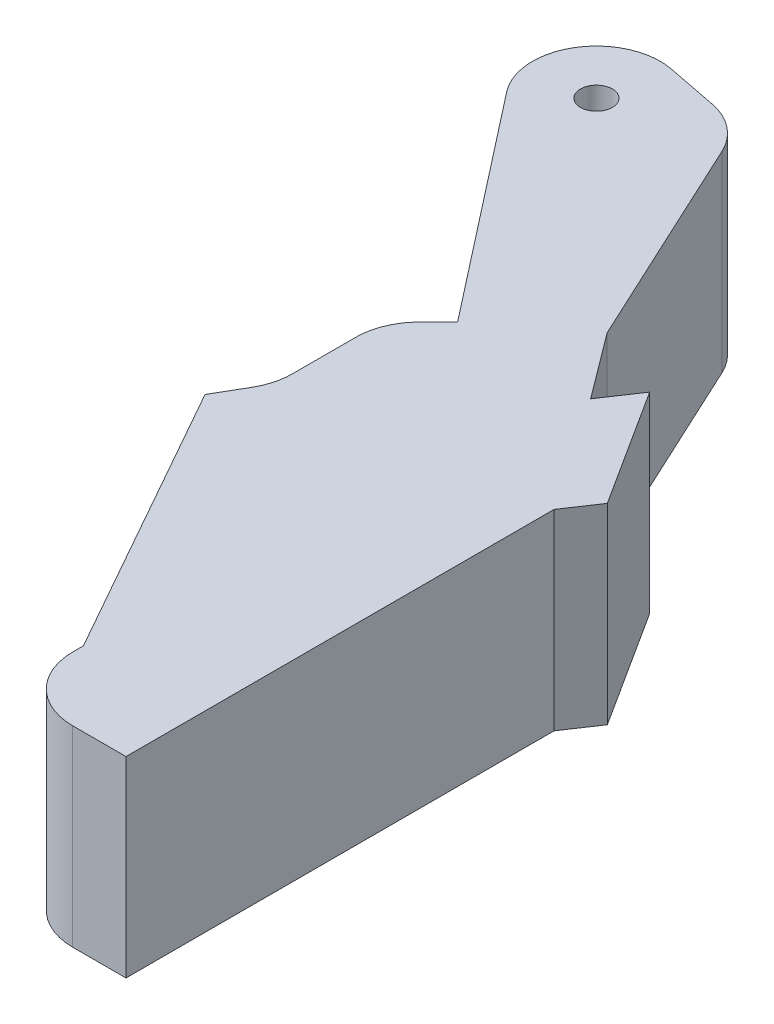
ISO-10303-21;
HEADER;
FILE_DESCRIPTION(('STEP AP214'),'2;1');
FILE_NAME('part.step','',(''),(''),'','','');
FILE_SCHEMA(('AUTOMOTIVE_DESIGN { 1 0 10303 214 1 1 1 1 }'));
ENDSEC;
DATA;
#1=APPLICATION_CONTEXT('core data for automotive mechanical design processes');
#2=APPLICATION_PROTOCOL_DEFINITION('international standard','automotive_design',2000,#1);
#3=PRODUCT_CONTEXT('',#1,'mechanical');
#4=PRODUCT('Part','Part','',(#3));
#5=PRODUCT_RELATED_PRODUCT_CATEGORY('part','',(#4));
#6=PRODUCT_DEFINITION_FORMATION('','',#4);
#7=PRODUCT_DEFINITION_CONTEXT('part definition',#1,'design');
#8=PRODUCT_DEFINITION('design','',#6,#7);
#9=PRODUCT_DEFINITION_SHAPE('','',#8);
#10=(LENGTH_UNIT() NAMED_UNIT(*) SI_UNIT(.MILLI.,.METRE.));
#11=(NAMED_UNIT(*) PLANE_ANGLE_UNIT() SI_UNIT($,.RADIAN.));
#12=(NAMED_UNIT(*) SI_UNIT($,.STERADIAN.) SOLID_ANGLE_UNIT());
#13=UNCERTAINTY_MEASURE_WITH_UNIT(LENGTH_MEASURE(1.E-05),#10,'distance_accuracy_value','');
#14=(GEOMETRIC_REPRESENTATION_CONTEXT(3) GLOBAL_UNCERTAINTY_ASSIGNED_CONTEXT((#13)) GLOBAL_UNIT_ASSIGNED_CONTEXT((#10,
#11,#12)) REPRESENTATION_CONTEXT('',''));
#15=CARTESIAN_POINT('',(0.,0.,0.));
#16=DIRECTION('',(0.,0.,1.));
#17=DIRECTION('',(1.,0.,0.));
#18=AXIS2_PLACEMENT_3D('',#15,#16,#17);
#19=CARTESIAN_POINT('',(26.2980985027857,9.,33.6825538196853));
#20=DIRECTION('',(0.713266412495161,0.,0.700893019516019));
#21=DIRECTION('',(0.700893019516019,0.,-0.713266412495161));
#22=AXIS2_PLACEMENT_3D('',#19,#20,#21);
#23=PLANE('',#22);
#24=DIRECTION('',(-0.700893019516019,0.,0.713266412495161));
#25=VECTOR('',#24,1.);
#26=CARTESIAN_POINT('',(26.2980985027857,-9.,33.6825538196853));
#27=LINE('',#26,#25);
#28=CARTESIAN_POINT('',(26.2980985027857,-9.,33.6825538196853));
#29=VERTEX_POINT('',#28);
#30=CARTESIAN_POINT('',(24.4923759572537,-9.,35.5201541469117));
#31=VERTEX_POINT('',#30);
#32=EDGE_CURVE('E216',#29,#31,#27,.T.);
#33=ORIENTED_EDGE('',*,*,#32,.T.);
#34=DIRECTION('',(0.,-1.,0.));
#35=VECTOR('',#34,1.);
#36=CARTESIAN_POINT('',(24.4923759572537,9.,35.5201541469117));
#37=LINE('',#36,#35);
#38=CARTESIAN_POINT('',(24.4923759572537,9.,35.5201541469117));
#39=VERTEX_POINT('',#38);
#40=EDGE_CURVE('E294',#31,#39,#37,.F.);
#41=ORIENTED_EDGE('',*,*,#40,.T.);
#42=DIRECTION('',(-0.700893019516019,0.,0.713266412495161));
#43=VECTOR('',#42,1.);
#44=CARTESIAN_POINT('',(26.2980985027857,9.,33.6825538196853));
#45=LINE('',#44,#43);
#46=CARTESIAN_POINT('',(26.2980985027857,9.,33.6825538196853));
#47=VERTEX_POINT('',#46);
#48=EDGE_CURVE('E251',#47,#39,#45,.T.);
#49=ORIENTED_EDGE('',*,*,#48,.F.);
#50=DIRECTION('',(0.,-1.,0.));
#51=VECTOR('',#50,1.);
#52=CARTESIAN_POINT('',(26.2980985027857,9.,33.6825538196853));
#53=LINE('',#52,#51);
#54=EDGE_CURVE('E215',#47,#29,#53,.T.);
#55=ORIENTED_EDGE('',*,*,#54,.T.);
#56=EDGE_LOOP('',(#33,#41,#49,#55));
#57=FACE_BOUND('',#56,.T.);
#58=ADVANCED_FACE('F32',(#57),#23,.F.);
#59=CARTESIAN_POINT('',(22.7719744322246,9.,37.270927217324));
#60=DIRECTION('',(1.,0.,0.));
#61=DIRECTION('',(0.,0.,-1.));
#62=AXIS2_PLACEMENT_3D('',#59,#60,#61);
#63=PLANE('',#62);
#64=DIRECTION('',(0.,0.,1.));
#65=VECTOR('',#64,1.);
#66=CARTESIAN_POINT('',(22.7719744322246,9.,37.270927217324));
#67=LINE('',#66,#65);
#68=CARTESIAN_POINT('',(22.7719744322246,9.,39.7255122640078));
#69=VERTEX_POINT('',#68);
#70=CARTESIAN_POINT('',(22.7719744322246,9.,45.6584863931885));
#71=VERTEX_POINT('',#70);
#72=EDGE_CURVE('E174',#69,#71,#67,.T.);
#73=ORIENTED_EDGE('',*,*,#72,.F.);
#74=DIRECTION('',(0.,-1.,0.));
#75=VECTOR('',#74,1.);
#76=CARTESIAN_POINT('',(22.7719744322246,9.,39.7255122640078));
#77=LINE('',#76,#75);
#78=CARTESIAN_POINT('',(22.7719744322246,-9.,39.7255122640078));
#79=VERTEX_POINT('',#78);
#80=EDGE_CURVE('E289',#69,#79,#77,.T.);
#81=ORIENTED_EDGE('',*,*,#80,.T.);
#82=DIRECTION('',(0.,0.,1.));
#83=VECTOR('',#82,1.);
#84=CARTESIAN_POINT('',(22.7719744322246,-9.,37.270927217324));
#85=LINE('',#84,#83);
#86=CARTESIAN_POINT('',(22.7719744322246,-9.,45.6584863931885));
#87=VERTEX_POINT('',#86);
#88=EDGE_CURVE('E219',#79,#87,#85,.T.);
#89=ORIENTED_EDGE('',*,*,#88,.T.);
#90=DIRECTION('',(0.,-1.,0.));
#91=VECTOR('',#90,1.);
#92=CARTESIAN_POINT('',(22.7719744322246,9.,45.6584863931885));
#93=LINE('',#92,#91);
#94=EDGE_CURVE('E287',#87,#71,#93,.F.);
#95=ORIENTED_EDGE('',*,*,#94,.T.);
#96=EDGE_LOOP('',(#73,#81,#89,#95));
#97=FACE_BOUND('',#96,.T.);
#98=ADVANCED_FACE('F340',(#97),#63,.F.);
#99=CARTESIAN_POINT('',(22.7719744322246,9.,47.270927217324));
#100=DIRECTION('',(0.865286645538015,0.,0.501277389330069));
#101=DIRECTION('',(0.501277389330069,0.,-0.865286645538015));
#102=AXIS2_PLACEMENT_3D('',#99,#100,#101);
#103=PLANE('',#102);
#104=DIRECTION('',(-0.501277389330069,0.,0.865286645538015));
#105=VECTOR('',#104,1.);
#106=CARTESIAN_POINT('',(22.7719744322246,9.,47.270927217324));
#107=LINE('',#106,#105);
#108=CARTESIAN_POINT('',(21.9636943054527,9.,48.6661507291689));
#109=VERTEX_POINT('',#108);
#110=CARTESIAN_POINT('',(20.3513196414554,9.,51.4493727416863));
#111=VERTEX_POINT('',#110);
#112=EDGE_CURVE('E162',#109,#111,#107,.T.);
#113=ORIENTED_EDGE('',*,*,#112,.F.);
#114=DIRECTION('',(0.,-1.,0.));
#115=VECTOR('',#114,1.);
#116=CARTESIAN_POINT('',(21.9636943054527,-9.,48.6661507291689));
#117=LINE('',#116,#115);
#118=CARTESIAN_POINT('',(21.9636943054527,-9.,48.6661507291689));
#119=VERTEX_POINT('',#118);
#120=EDGE_CURVE('E298',#109,#119,#117,.T.);
#121=ORIENTED_EDGE('',*,*,#120,.T.);
#122=DIRECTION('',(-0.501277389330069,0.,0.865286645538015));
#123=VECTOR('',#122,1.);
#124=CARTESIAN_POINT('',(22.7719744322246,-9.,47.270927217324));
#125=LINE('',#124,#123);
#126=CARTESIAN_POINT('',(20.3513196414554,-9.,51.4493727416863));
#127=VERTEX_POINT('',#126);
#128=EDGE_CURVE('E180',#119,#127,#125,.T.);
#129=ORIENTED_EDGE('',*,*,#128,.T.);
#130=DIRECTION('',(0.,-1.,0.));
#131=VECTOR('',#130,1.);
#132=CARTESIAN_POINT('',(20.3513196414554,9.,51.4493727416863));
#133=LINE('',#132,#131);
#134=EDGE_CURVE('E177',#111,#127,#133,.T.);
#135=ORIENTED_EDGE('',*,*,#134,.F.);
#136=EDGE_LOOP('',(#113,#121,#129,#135));
#137=FACE_BOUND('',#136,.T.);
#138=ADVANCED_FACE('F178',(#137),#103,.F.);
#139=CARTESIAN_POINT('',(20.3513196414554,9.,51.4493727416863));
#140=DIRECTION('',(0.871303410753923,0.,-0.490744705940453));
#141=DIRECTION('',(-0.490744705940453,0.,-0.871303410753923));
#142=AXIS2_PLACEMENT_3D('',#139,#140,#141);
#143=PLANE('',#142);
#144=DIRECTION('',(0.490744705940453,0.,0.871303410753923));
#145=VECTOR('',#144,1.);
#146=CARTESIAN_POINT('',(20.3513196414554,-9.,51.4493727416863));
#147=LINE('',#146,#145);
#148=CARTESIAN_POINT('',(35.073660819669,-9.,77.5884750643039));
#149=VERTEX_POINT('',#148);
#150=EDGE_CURVE('E224',#127,#149,#147,.T.);
#151=ORIENTED_EDGE('',*,*,#150,.T.);
#152=DIRECTION('',(0.,-1.,0.));
#153=VECTOR('',#152,1.);
#154=CARTESIAN_POINT('',(35.073660819669,9.,77.5884750643039));
#155=LINE('',#154,#153);
#156=CARTESIAN_POINT('',(35.073660819669,9.,77.5884750643039));
#157=VERTEX_POINT('',#156);
#158=EDGE_CURVE('E184',#157,#149,#155,.T.);
#159=ORIENTED_EDGE('',*,*,#158,.F.);
#160=DIRECTION('',(0.490744705940453,0.,0.871303410753923));
#161=VECTOR('',#160,1.);
#162=CARTESIAN_POINT('',(20.3513196414554,9.,51.4493727416863));
#163=LINE('',#162,#161);
#164=EDGE_CURVE('E166',#111,#157,#163,.T.);
#165=ORIENTED_EDGE('',*,*,#164,.F.);
#166=ORIENTED_EDGE('',*,*,#134,.T.);
#167=EDGE_LOOP('',(#151,#159,#165,#166));
#168=FACE_BOUND('',#167,.T.);
#169=ADVANCED_FACE('F186',(#168),#143,.F.);
#170=CARTESIAN_POINT('',(35.073660819669,9.,77.5884750643039));
#171=DIRECTION('',(1.,0.,0.));
#172=DIRECTION('',(0.,0.,-1.));
#173=AXIS2_PLACEMENT_3D('',#170,#171,#172);
#174=PLANE('',#173);
#175=DIRECTION('',(0.,0.,1.));
#176=VECTOR('',#175,1.);
#177=CARTESIAN_POINT('',(35.073660819669,-9.,77.5884750643039));
#178=LINE('',#177,#176);
#179=CARTESIAN_POINT('',(35.073660819669,-9.,78.5884750643039));
#180=VERTEX_POINT('',#179);
#181=EDGE_CURVE('E226',#149,#180,#178,.T.);
#182=ORIENTED_EDGE('',*,*,#181,.T.);
#183=DIRECTION('',(0.,-1.,0.));
#184=VECTOR('',#183,1.);
#185=CARTESIAN_POINT('',(35.073660819669,9.,78.5884750643039));
#186=LINE('',#185,#184);
#187=CARTESIAN_POINT('',(35.073660819669,9.,78.5884750643039));
#188=VERTEX_POINT('',#187);
#189=EDGE_CURVE('E40',#180,#188,#186,.F.);
#190=ORIENTED_EDGE('',*,*,#189,.T.);
#191=DIRECTION('',(0.,0.,1.));
#192=VECTOR('',#191,1.);
#193=CARTESIAN_POINT('',(35.073660819669,9.,77.5884750643039));
#194=LINE('',#193,#192);
#195=EDGE_CURVE('E188',#157,#188,#194,.T.);
#196=ORIENTED_EDGE('',*,*,#195,.F.);
#197=ORIENTED_EDGE('',*,*,#158,.T.);
#198=EDGE_LOOP('',(#182,#190,#196,#197));
#199=FACE_BOUND('',#198,.T.);
#200=ADVANCED_FACE('F419',(#199),#174,.F.);
#201=CARTESIAN_POINT('',(35.073660819669,9.,84.5884750643039));
#202=DIRECTION('',(0.,0.,-1.));
#203=DIRECTION('',(-1.,0.,0.));
#204=AXIS2_PLACEMENT_3D('',#201,#202,#203);
#205=PLANE('',#204);
#206=DIRECTION('',(1.,0.,0.));
#207=VECTOR('',#206,1.);
#208=CARTESIAN_POINT('',(35.073660819669,9.,84.5884750643039));
#209=LINE('',#208,#207);
#210=CARTESIAN_POINT('',(41.073660819669,9.,84.5884750643039));
#211=VERTEX_POINT('',#210);
#212=CARTESIAN_POINT('',(46.073660819669,9.,84.5884750643039));
#213=VERTEX_POINT('',#212);
#214=EDGE_CURVE('E190',#211,#213,#209,.T.);
#215=ORIENTED_EDGE('',*,*,#214,.F.);
#216=DIRECTION('',(0.,-1.,0.));
#217=VECTOR('',#216,1.);
#218=CARTESIAN_POINT('',(41.073660819669,9.,84.5884750643039));
#219=LINE('',#218,#217);
#220=CARTESIAN_POINT('',(41.073660819669,-9.,84.5884750643039));
#221=VERTEX_POINT('',#220);
#222=EDGE_CURVE('E303',#211,#221,#219,.T.);
#223=ORIENTED_EDGE('',*,*,#222,.T.);
#224=DIRECTION('',(1.,0.,0.));
#225=VECTOR('',#224,1.);
#226=CARTESIAN_POINT('',(35.073660819669,-9.,84.5884750643039));
#227=LINE('',#226,#225);
#228=CARTESIAN_POINT('',(46.073660819669,-9.,84.5884750643039));
#229=VERTEX_POINT('',#228);
#230=EDGE_CURVE('E228',#221,#229,#227,.T.);
#231=ORIENTED_EDGE('',*,*,#230,.T.);
#232=DIRECTION('',(0.,-1.,0.));
#233=VECTOR('',#232,1.);
#234=CARTESIAN_POINT('',(46.073660819669,9.,84.5884750643039));
#235=LINE('',#234,#233);
#236=EDGE_CURVE('E266',#213,#229,#235,.T.);
#237=ORIENTED_EDGE('',*,*,#236,.F.);
#238=EDGE_LOOP('',(#215,#223,#231,#237));
#239=FACE_BOUND('',#238,.T.);
#240=ADVANCED_FACE('F309',(#239),#205,.F.);
#241=CARTESIAN_POINT('',(46.073660819669,9.,84.5884750643039));
#242=DIRECTION('',(-1.,0.,0.));
#243=DIRECTION('',(0.,0.,1.));
#244=AXIS2_PLACEMENT_3D('',#241,#242,#243);
#245=PLANE('',#244);
#246=DIRECTION('',(0.,0.,-1.));
#247=VECTOR('',#246,1.);
#248=CARTESIAN_POINT('',(46.073660819669,-9.,84.5884750643039));
#249=LINE('',#248,#247);
#250=CARTESIAN_POINT('',(46.073660819669,-9.,44.4086004960532));
#251=VERTEX_POINT('',#250);
#252=EDGE_CURVE('E230',#229,#251,#249,.T.);
#253=ORIENTED_EDGE('',*,*,#252,.T.);
#254=DIRECTION('',(0.,-1.,0.));
#255=VECTOR('',#254,1.);
#256=CARTESIAN_POINT('',(46.073660819669,9.,44.4086004960532));
#257=LINE('',#256,#255);
#258=CARTESIAN_POINT('',(46.073660819669,9.,44.4086004960532));
#259=VERTEX_POINT('',#258);
#260=EDGE_CURVE('E263',#259,#251,#257,.T.);
#261=ORIENTED_EDGE('',*,*,#260,.F.);
#262=DIRECTION('',(0.,0.,-1.));
#263=VECTOR('',#262,1.);
#264=CARTESIAN_POINT('',(46.073660819669,9.,84.5884750643039));
#265=LINE('',#264,#263);
#266=EDGE_CURVE('E195',#213,#259,#265,.T.);
#267=ORIENTED_EDGE('',*,*,#266,.F.);
#268=ORIENTED_EDGE('',*,*,#236,.T.);
#269=EDGE_LOOP('',(#253,#261,#267,#268));
#270=FACE_BOUND('',#269,.T.);
#271=ADVANCED_FACE('F319',(#270),#245,.F.);
#272=CARTESIAN_POINT('',(46.073660819669,9.,44.4086004960532));
#273=DIRECTION('',(-0.830910584121357,0.,-0.556405967972222));
#274=DIRECTION('',(-0.556405967972222,0.,0.830910584121357));
#275=AXIS2_PLACEMENT_3D('',#272,#273,#274);
#276=PLANE('',#275);
#277=DIRECTION('',(0.556405967972222,0.,-0.830910584121357));
#278=VECTOR('',#277,1.);
#279=CARTESIAN_POINT('',(46.073660819669,-9.,44.4086004960532));
#280=LINE('',#279,#278);
#281=CARTESIAN_POINT('',(48.0785400909475,-9.,41.4146077959714));
#282=VERTEX_POINT('',#281);
#283=EDGE_CURVE('E232',#251,#282,#280,.T.);
#284=ORIENTED_EDGE('',*,*,#283,.T.);
#285=DIRECTION('',(0.,-1.,0.));
#286=VECTOR('',#285,1.);
#287=CARTESIAN_POINT('',(48.0785400909475,9.,41.4146077959714));
#288=LINE('',#287,#286);
#289=CARTESIAN_POINT('',(48.0785400909475,9.,41.4146077959714));
#290=VERTEX_POINT('',#289);
#291=EDGE_CURVE('E260',#290,#282,#288,.T.);
#292=ORIENTED_EDGE('',*,*,#291,.F.);
#293=DIRECTION('',(0.556405967972222,0.,-0.830910584121357));
#294=VECTOR('',#293,1.);
#295=CARTESIAN_POINT('',(46.073660819669,9.,44.4086004960532));
#296=LINE('',#295,#294);
#297=EDGE_CURVE('E197',#259,#290,#296,.T.);
#298=ORIENTED_EDGE('',*,*,#297,.F.);
#299=ORIENTED_EDGE('',*,*,#260,.T.);
#300=EDGE_LOOP('',(#284,#292,#298,#299));
#301=FACE_BOUND('',#300,.T.);
#302=ADVANCED_FACE('F323',(#301),#276,.F.);
#303=CARTESIAN_POINT('',(48.0785400909475,9.,41.4146077959714));
#304=DIRECTION('',(-0.842411688467819,0.,0.538834433878161));
#305=DIRECTION('',(0.538834433878161,0.,0.842411688467819));
#306=AXIS2_PLACEMENT_3D('',#303,#304,#305);
#307=PLANE('',#306);
#308=DIRECTION('',(-0.538834433878161,0.,-0.842411688467819));
#309=VECTOR('',#308,1.);
#310=CARTESIAN_POINT('',(48.0785400909475,-9.,41.4146077959714));
#311=LINE('',#310,#309);
#312=CARTESIAN_POINT('',(41.0230100067657,-9.,30.3840191075821));
#313=VERTEX_POINT('',#312);
#314=EDGE_CURVE('E234',#282,#313,#311,.T.);
#315=ORIENTED_EDGE('',*,*,#314,.T.);
#316=DIRECTION('',(0.,-1.,0.));
#317=VECTOR('',#316,1.);
#318=CARTESIAN_POINT('',(41.0230100067657,9.,30.3840191075821));
#319=LINE('',#318,#317);
#320=CARTESIAN_POINT('',(41.0230100067657,9.,30.3840191075821));
#321=VERTEX_POINT('',#320);
#322=EDGE_CURVE('E258',#321,#313,#319,.T.);
#323=ORIENTED_EDGE('',*,*,#322,.F.);
#324=DIRECTION('',(-0.538834433878161,0.,-0.842411688467819));
#325=VECTOR('',#324,1.);
#326=CARTESIAN_POINT('',(48.0785400909475,9.,41.4146077959714));
#327=LINE('',#326,#325);
#328=EDGE_CURVE('E199',#290,#321,#327,.T.);
#329=ORIENTED_EDGE('',*,*,#328,.F.);
#330=ORIENTED_EDGE('',*,*,#291,.T.);
#331=EDGE_LOOP('',(#315,#323,#329,#330));
#332=FACE_BOUND('',#331,.T.);
#333=ADVANCED_FACE('F408',(#332),#307,.F.);
#334=CARTESIAN_POINT('',(38.8008517192327,9.,33.7024861028828));
#335=DIRECTION('',(-0.830910584121357,0.,-0.556405967972222));
#336=DIRECTION('',(-0.556405967972222,0.,0.830910584121357));
#337=AXIS2_PLACEMENT_3D('',#334,#335,#336);
#338=PLANE('',#337);
#339=DIRECTION('',(0.556405967972222,0.,-0.830910584121357));
#340=VECTOR('',#339,1.);
#341=CARTESIAN_POINT('',(38.8008517192327,-9.,33.7024861028828));
#342=LINE('',#341,#340);
#343=CARTESIAN_POINT('',(38.8008517192327,-9.,33.7024861028828));
#344=VERTEX_POINT('',#343);
#345=EDGE_CURVE('E237',#344,#313,#342,.T.);
#346=ORIENTED_EDGE('',*,*,#345,.F.);
#347=DIRECTION('',(0.,-1.,0.));
#348=VECTOR('',#347,1.);
#349=CARTESIAN_POINT('',(38.8008517192327,9.,33.7024861028828));
#350=LINE('',#349,#348);
#351=CARTESIAN_POINT('',(38.8008517192327,9.,33.7024861028828));
#352=VERTEX_POINT('',#351);
#353=EDGE_CURVE('E256',#352,#344,#350,.T.);
#354=ORIENTED_EDGE('',*,*,#353,.F.);
#355=DIRECTION('',(0.556405967972222,0.,-0.830910584121357));
#356=VECTOR('',#355,1.);
#357=CARTESIAN_POINT('',(38.8008517192327,9.,33.7024861028828));
#358=LINE('',#357,#356);
#359=EDGE_CURVE('E201',#352,#321,#358,.T.);
#360=ORIENTED_EDGE('',*,*,#359,.T.);
#361=ORIENTED_EDGE('',*,*,#322,.T.);
#362=EDGE_LOOP('',(#346,#354,#360,#361));
#363=FACE_BOUND('',#362,.T.);
#364=ADVANCED_FACE('F404',(#363),#338,.T.);
#365=CARTESIAN_POINT('',(34.2088855622189,9.,27.5654100335458));
#366=DIRECTION('',(0.800678383455674,0.,-0.599094421829154));
#367=DIRECTION('',(-0.599094421829154,0.,-0.800678383455674));
#368=AXIS2_PLACEMENT_3D('',#365,#366,#367);
#369=PLANE('',#368);
#370=DIRECTION('',(0.599094421829154,0.,0.800678383455674));
#371=VECTOR('',#370,1.);
#372=CARTESIAN_POINT('',(34.2088855622189,-9.,27.5654100335458));
#373=LINE('',#372,#371);
#374=CARTESIAN_POINT('',(34.2088855622189,-9.,27.5654100335458));
#375=VERTEX_POINT('',#374);
#376=EDGE_CURVE('E240',#375,#344,#373,.T.);
#377=ORIENTED_EDGE('',*,*,#376,.F.);
#378=DIRECTION('',(0.,-1.,0.));
#379=VECTOR('',#378,1.);
#380=CARTESIAN_POINT('',(34.2088855622189,9.,27.5654100335458));
#381=LINE('',#380,#379);
#382=CARTESIAN_POINT('',(34.2088855622189,9.,27.5654100335458));
#383=VERTEX_POINT('',#382);
#384=EDGE_CURVE('E253',#383,#375,#381,.T.);
#385=ORIENTED_EDGE('',*,*,#384,.F.);
#386=DIRECTION('',(0.599094421829154,0.,0.800678383455674));
#387=VECTOR('',#386,1.);
#388=CARTESIAN_POINT('',(34.2088855622189,9.,27.5654100335458));
#389=LINE('',#388,#387);
#390=EDGE_CURVE('E204',#383,#352,#389,.T.);
#391=ORIENTED_EDGE('',*,*,#390,.T.);
#392=ORIENTED_EDGE('',*,*,#353,.T.);
#393=EDGE_LOOP('',(#377,#385,#391,#392));
#394=FACE_BOUND('',#393,.T.);
#395=ADVANCED_FACE('F400',(#394),#369,.T.);
#396=CARTESIAN_POINT('',(23.5490594283848,9.,4.630529131579));
#397=DIRECTION('',(0.906835387954946,0.,-0.421484969070788));
#398=DIRECTION('',(-0.421484969070788,0.,-0.906835387954946));
#399=AXIS2_PLACEMENT_3D('',#396,#397,#398);
#400=PLANE('',#399);
#401=DIRECTION('',(0.421484969070788,0.,0.906835387954946));
#402=VECTOR('',#401,1.);
#403=CARTESIAN_POINT('',(23.5490594283848,-9.,4.630529131579));
#404=LINE('',#403,#402);
#405=CARTESIAN_POINT('',(24.8361384467123,-9.,7.39971163288352));
#406=VERTEX_POINT('',#405);
#407=EDGE_CURVE('E243',#406,#375,#404,.T.);
#408=ORIENTED_EDGE('',*,*,#407,.F.);
#409=DIRECTION('',(0.,-1.,0.));
#410=VECTOR('',#409,1.);
#411=CARTESIAN_POINT('',(24.8361384467123,9.,7.39971163288352));
#412=LINE('',#411,#410);
#413=CARTESIAN_POINT('',(24.8361384467123,9.,7.39971163288352));
#414=VERTEX_POINT('',#413);
#415=EDGE_CURVE('E278',#406,#414,#412,.F.);
#416=ORIENTED_EDGE('',*,*,#415,.T.);
#417=DIRECTION('',(0.421484969070788,0.,0.906835387954946));
#418=VECTOR('',#417,1.);
#419=CARTESIAN_POINT('',(23.5490594283848,9.,4.630529131579));
#420=LINE('',#419,#418);
#421=EDGE_CURVE('E207',#414,#383,#420,.T.);
#422=ORIENTED_EDGE('',*,*,#421,.T.);
#423=ORIENTED_EDGE('',*,*,#384,.T.);
#424=EDGE_LOOP('',(#408,#416,#422,#423));
#425=FACE_BOUND('',#424,.T.);
#426=ADVANCED_FACE('F396',(#425),#400,.T.);
#427=CARTESIAN_POINT('',(0.,9.,0.));
#428=DIRECTION('',(0.192938713815792,0.,-0.981210809516033));
#429=DIRECTION('',(-0.981210809516033,0.,-0.192938713815792));
#430=AXIS2_PLACEMENT_3D('',#427,#428,#429);
#431=PLANE('',#430);
#432=DIRECTION('',(0.981210809516033,0.,0.192938713815792));
#433=VECTOR('',#432,1.);
#434=CARTESIAN_POINT('',(0.,9.,0.));
#435=LINE('',#434,#433);
#436=CARTESIAN_POINT('',(15.7906101619771,9.,3.10495969415699));
#437=VERTEX_POINT('',#436);
#438=CARTESIAN_POINT('',(20.5527584018774,9.,4.04135659021205));
#439=VERTEX_POINT('',#438);
#440=EDGE_CURVE('E209',#437,#439,#435,.T.);
#441=ORIENTED_EDGE('',*,*,#440,.T.);
#442=DIRECTION('',(0.,-1.,0.));
#443=VECTOR('',#442,1.);
#444=CARTESIAN_POINT('',(20.5527584018774,9.,4.04135659021206));
#445=LINE('',#444,#443);
#446=CARTESIAN_POINT('',(20.5527584018774,-9.,4.04135659021205));
#447=VERTEX_POINT('',#446);
#448=EDGE_CURVE('E271',#439,#447,#445,.T.);
#449=ORIENTED_EDGE('',*,*,#448,.T.);
#450=DIRECTION('',(0.981210809516033,0.,0.192938713815792));
#451=VECTOR('',#450,1.);
#452=CARTESIAN_POINT('',(0.,-9.,0.));
#453=LINE('',#452,#451);
#454=CARTESIAN_POINT('',(15.7906101619771,-9.,3.10495969415699));
#455=VERTEX_POINT('',#454);
#456=EDGE_CURVE('E245',#455,#447,#453,.T.);
#457=ORIENTED_EDGE('',*,*,#456,.F.);
#458=DIRECTION('',(0.,-1.,0.));
#459=VECTOR('',#458,1.);
#460=CARTESIAN_POINT('',(15.7906101619771,9.,3.10495969415699));
#461=LINE('',#460,#459);
#462=EDGE_CURVE('E183',#455,#437,#461,.F.);
#463=ORIENTED_EDGE('',*,*,#462,.T.);
#464=EDGE_LOOP('',(#441,#449,#457,#463));
#465=FACE_BOUND('',#464,.T.);
#466=ADVANCED_FACE('F390',(#465),#431,.T.);
#467=CARTESIAN_POINT('',(26.2980985027857,9.,33.6825538196853));
#468=DIRECTION('',(-0.788210487321746,0.,0.615405742316414));
#469=DIRECTION('',(0.615405742316414,0.,0.788210487321746));
#470=AXIS2_PLACEMENT_3D('',#467,#468,#469);
#471=PLANE('',#470);
#472=DIRECTION('',(-0.615405742316414,0.,-0.788210487321746));
#473=VECTOR('',#472,1.);
#474=CARTESIAN_POINT('',(26.2980985027857,9.,33.6825538196853));
#475=LINE('',#474,#473);
#476=CARTESIAN_POINT('',(9.9037149551519,9.,12.6846590051517));
#477=VERTEX_POINT('',#476);
#478=EDGE_CURVE('E212',#47,#477,#475,.T.);
#479=ORIENTED_EDGE('',*,*,#478,.T.);
#480=DIRECTION('',(0.,-1.,0.));
#481=VECTOR('',#480,1.);
#482=CARTESIAN_POINT('',(9.90371495515191,9.,12.6846590051517));
#483=LINE('',#482,#481);
#484=CARTESIAN_POINT('',(9.9037149551519,-9.,12.6846590051517));
#485=VERTEX_POINT('',#484);
#486=EDGE_CURVE('E284',#477,#485,#483,.T.);
#487=ORIENTED_EDGE('',*,*,#486,.T.);
#488=DIRECTION('',(-0.615405742316414,0.,-0.788210487321746));
#489=VECTOR('',#488,1.);
#490=CARTESIAN_POINT('',(26.2980985027857,-9.,33.6825538196853));
#491=LINE('',#490,#489);
#492=EDGE_CURVE('E248',#29,#485,#491,.T.);
#493=ORIENTED_EDGE('',*,*,#492,.F.);
#494=ORIENTED_EDGE('',*,*,#54,.F.);
#495=EDGE_LOOP('',(#479,#487,#493,#494));
#496=FACE_BOUND('',#495,.T.);
#497=ADVANCED_FACE('F383',(#496),#471,.T.);
#498=CARTESIAN_POINT('',(0.,9.,0.));
#499=DIRECTION('',(0.,-1.,0.));
#500=DIRECTION('',(0.,0.,-1.));
#501=AXIS2_PLACEMENT_3D('',#498,#499,#500);
#502=PLANE('',#501);
#503=CARTESIAN_POINT('',(14.6329778790824,9.,8.99222455125319));
#504=DIRECTION('',(0.,1.,0.));
#505=DIRECTION('',(0.,0.,1.));
#506=AXIS2_PLACEMENT_3D('',#503,#504,#505);
#507=CIRCLE('',#506,1.5);
#508=CARTESIAN_POINT('',(14.6329778790824,9.,10.4922245512532));
#509=VERTEX_POINT('',#508);
#510=EDGE_CURVE('E373',#509,#509,#507,.T.);
#511=ORIENTED_EDGE('',*,*,#510,.F.);
#512=EDGE_LOOP('',(#511));
#513=FACE_BOUND('',#512,.T.);
#514=ORIENTED_EDGE('',*,*,#195,.T.);
#515=CARTESIAN_POINT('',(41.073660819669,9.,78.5884750643039));
#516=DIRECTION('',(0.,-1.,0.));
#517=DIRECTION('',(0.,0.,-1.));
#518=AXIS2_PLACEMENT_3D('',#515,#516,#517);
#519=CIRCLE('',#518,6.);
#520=EDGE_CURVE('E11',#188,#211,#519,.F.);
#521=ORIENTED_EDGE('',*,*,#520,.T.);
#522=ORIENTED_EDGE('',*,*,#214,.T.);
#523=ORIENTED_EDGE('',*,*,#266,.T.);
#524=ORIENTED_EDGE('',*,*,#297,.T.);
#525=ORIENTED_EDGE('',*,*,#328,.T.);
#526=ORIENTED_EDGE('',*,*,#359,.F.);
#527=ORIENTED_EDGE('',*,*,#390,.F.);
#528=ORIENTED_EDGE('',*,*,#421,.F.);
#529=CARTESIAN_POINT('',(19.3951261189826,9.,9.92862144730825));
#530=DIRECTION('',(0.,-1.,0.));
#531=DIRECTION('',(0.,0.,-1.));
#532=AXIS2_PLACEMENT_3D('',#529,#530,#531);
#533=CIRCLE('',#532,6.);
#534=EDGE_CURVE('E282',#414,#439,#533,.F.);
#535=ORIENTED_EDGE('',*,*,#534,.T.);
#536=ORIENTED_EDGE('',*,*,#440,.F.);
#537=CARTESIAN_POINT('',(14.6329778790824,9.,8.99222455125319));
#538=DIRECTION('',(0.,-1.,0.));
#539=DIRECTION('',(0.,0.,-1.));
#540=AXIS2_PLACEMENT_3D('',#537,#538,#539);
#541=CIRCLE('',#540,6.);
#542=EDGE_CURVE('E280',#437,#477,#541,.F.);
#543=ORIENTED_EDGE('',*,*,#542,.T.);
#544=ORIENTED_EDGE('',*,*,#478,.F.);
#545=ORIENTED_EDGE('',*,*,#48,.T.);
#546=CARTESIAN_POINT('',(28.7719744322246,9.,39.7255122640078));
#547=DIRECTION('',(0.,-1.,0.));
#548=DIRECTION('',(0.,0.,-1.));
#549=AXIS2_PLACEMENT_3D('',#546,#547,#548);
#550=CIRCLE('',#549,6.);
#551=EDGE_CURVE('E296',#39,#69,#550,.F.);
#552=ORIENTED_EDGE('',*,*,#551,.T.);
#553=ORIENTED_EDGE('',*,*,#72,.T.);
#554=CARTESIAN_POINT('',(16.7719744322246,9.,45.6584863931885));
#555=DIRECTION('',(0.,-1.,0.));
#556=DIRECTION('',(0.,0.,-1.));
#557=AXIS2_PLACEMENT_3D('',#554,#555,#556);
#558=CIRCLE('',#557,6.);
#559=EDGE_CURVE('E170',#71,#109,#558,.T.);
#560=ORIENTED_EDGE('',*,*,#559,.T.);
#561=ORIENTED_EDGE('',*,*,#112,.T.);
#562=ORIENTED_EDGE('',*,*,#164,.T.);
#563=EDGE_LOOP('',(#514,#521,#522,#523,#524,#525,#526,#527,#528,#535,#536,#543,#544,#545,#552,
#553,#560,#561,#562));
#564=FACE_BOUND('',#563,.T.);
#565=ADVANCED_FACE('F164',(#513,#564),#502,.F.);
#566=CARTESIAN_POINT('',(0.,-9.,0.));
#567=DIRECTION('',(0.,-1.,0.));
#568=DIRECTION('',(0.,0.,-1.));
#569=AXIS2_PLACEMENT_3D('',#566,#567,#568);
#570=PLANE('',#569);
#571=CARTESIAN_POINT('',(14.6329778790824,-9.,8.99222455125319));
#572=DIRECTION('',(0.,1.,0.));
#573=DIRECTION('',(0.,0.,1.));
#574=AXIS2_PLACEMENT_3D('',#571,#572,#573);
#575=CIRCLE('',#574,1.5);
#576=CARTESIAN_POINT('',(14.6329778790824,-9.,10.4922245512532));
#577=VERTEX_POINT('',#576);
#578=EDGE_CURVE('E220',#577,#577,#575,.T.);
#579=ORIENTED_EDGE('',*,*,#578,.T.);
#580=EDGE_LOOP('',(#579));
#581=FACE_BOUND('',#580,.T.);
#582=ORIENTED_EDGE('',*,*,#230,.F.);
#583=CARTESIAN_POINT('',(41.073660819669,-9.,78.5884750643039));
#584=DIRECTION('',(0.,-1.,0.));
#585=DIRECTION('',(0.,0.,-1.));
#586=AXIS2_PLACEMENT_3D('',#583,#584,#585);
#587=CIRCLE('',#586,6.);
#588=EDGE_CURVE('E54',#221,#180,#587,.T.);
#589=ORIENTED_EDGE('',*,*,#588,.T.);
#590=ORIENTED_EDGE('',*,*,#181,.F.);
#591=ORIENTED_EDGE('',*,*,#150,.F.);
#592=ORIENTED_EDGE('',*,*,#128,.F.);
#593=CARTESIAN_POINT('',(16.7719744322246,-9.,45.6584863931885));
#594=DIRECTION('',(0.,-1.,0.));
#595=DIRECTION('',(0.,0.,-1.));
#596=AXIS2_PLACEMENT_3D('',#593,#594,#595);
#597=CIRCLE('',#596,6.);
#598=EDGE_CURVE('E300',#119,#87,#597,.F.);
#599=ORIENTED_EDGE('',*,*,#598,.T.);
#600=ORIENTED_EDGE('',*,*,#88,.F.);
#601=CARTESIAN_POINT('',(28.7719744322246,-9.,39.7255122640078));
#602=DIRECTION('',(0.,-1.,0.));
#603=DIRECTION('',(0.,0.,-1.));
#604=AXIS2_PLACEMENT_3D('',#601,#602,#603);
#605=CIRCLE('',#604,6.);
#606=EDGE_CURVE('E292',#79,#31,#605,.T.);
#607=ORIENTED_EDGE('',*,*,#606,.T.);
#608=ORIENTED_EDGE('',*,*,#32,.F.);
#609=ORIENTED_EDGE('',*,*,#492,.T.);
#610=CARTESIAN_POINT('',(14.6329778790824,-9.,8.99222455125319));
#611=DIRECTION('',(0.,-1.,0.));
#612=DIRECTION('',(0.,0.,-1.));
#613=AXIS2_PLACEMENT_3D('',#610,#611,#612);
#614=CIRCLE('',#613,6.);
#615=EDGE_CURVE('E274',#485,#455,#614,.T.);
#616=ORIENTED_EDGE('',*,*,#615,.T.);
#617=ORIENTED_EDGE('',*,*,#456,.T.);
#618=CARTESIAN_POINT('',(19.3951261189826,-9.,9.92862144730825));
#619=DIRECTION('',(0.,-1.,0.));
#620=DIRECTION('',(0.,0.,-1.));
#621=AXIS2_PLACEMENT_3D('',#618,#619,#620);
#622=CIRCLE('',#621,6.);
#623=EDGE_CURVE('E276',#447,#406,#622,.T.);
#624=ORIENTED_EDGE('',*,*,#623,.T.);
#625=ORIENTED_EDGE('',*,*,#407,.T.);
#626=ORIENTED_EDGE('',*,*,#376,.T.);
#627=ORIENTED_EDGE('',*,*,#345,.T.);
#628=ORIENTED_EDGE('',*,*,#314,.F.);
#629=ORIENTED_EDGE('',*,*,#283,.F.);
#630=ORIENTED_EDGE('',*,*,#252,.F.);
#631=EDGE_LOOP('',(#582,#589,#590,#591,#592,#599,#600,#607,#608,#609,#616,#617,#624,#625,#626,
#627,#628,#629,#630));
#632=FACE_BOUND('',#631,.T.);
#633=ADVANCED_FACE('F314',(#581,#632),#570,.T.);
#634=CARTESIAN_POINT('',(19.3951261189826,9.,9.92862144730825));
#635=DIRECTION('',(0.,-1.,0.));
#636=DIRECTION('',(0.,0.,-1.));
#637=AXIS2_PLACEMENT_3D('',#634,#635,#636);
#638=CYLINDRICAL_SURFACE('',#637,6.);
#639=ORIENTED_EDGE('',*,*,#534,.F.);
#640=ORIENTED_EDGE('',*,*,#415,.F.);
#641=ORIENTED_EDGE('',*,*,#623,.F.);
#642=ORIENTED_EDGE('',*,*,#448,.F.);
#643=EDGE_LOOP('',(#639,#640,#641,#642));
#644=FACE_BOUND('',#643,.T.);
#645=ADVANCED_FACE('F350',(#644),#638,.T.);
#646=CARTESIAN_POINT('',(14.6329778790824,9.,8.99222455125319));
#647=DIRECTION('',(0.,-1.,0.));
#648=DIRECTION('',(0.,0.,-1.));
#649=AXIS2_PLACEMENT_3D('',#646,#647,#648);
#650=CYLINDRICAL_SURFACE('',#649,6.);
#651=ORIENTED_EDGE('',*,*,#542,.F.);
#652=ORIENTED_EDGE('',*,*,#462,.F.);
#653=ORIENTED_EDGE('',*,*,#615,.F.);
#654=ORIENTED_EDGE('',*,*,#486,.F.);
#655=EDGE_LOOP('',(#651,#652,#653,#654));
#656=FACE_BOUND('',#655,.T.);
#657=ADVANCED_FACE('F353',(#656),#650,.T.);
#658=CARTESIAN_POINT('',(28.7719744322246,9.,39.7255122640078));
#659=DIRECTION('',(0.,-1.,0.));
#660=DIRECTION('',(0.,0.,-1.));
#661=AXIS2_PLACEMENT_3D('',#658,#659,#660);
#662=CYLINDRICAL_SURFACE('',#661,6.);
#663=ORIENTED_EDGE('',*,*,#551,.F.);
#664=ORIENTED_EDGE('',*,*,#40,.F.);
#665=ORIENTED_EDGE('',*,*,#606,.F.);
#666=ORIENTED_EDGE('',*,*,#80,.F.);
#667=EDGE_LOOP('',(#663,#664,#665,#666));
#668=FACE_BOUND('',#667,.T.);
#669=ADVANCED_FACE('F337',(#668),#662,.T.);
#670=CARTESIAN_POINT('',(16.7719744322246,9.,45.6584863931885));
#671=DIRECTION('',(0.,1.,0.));
#672=DIRECTION('',(0.,0.,1.));
#673=AXIS2_PLACEMENT_3D('',#670,#671,#672);
#674=CYLINDRICAL_SURFACE('',#673,6.);
#675=ORIENTED_EDGE('',*,*,#559,.F.);
#676=ORIENTED_EDGE('',*,*,#94,.F.);
#677=ORIENTED_EDGE('',*,*,#598,.F.);
#678=ORIENTED_EDGE('',*,*,#120,.F.);
#679=EDGE_LOOP('',(#675,#676,#677,#678));
#680=FACE_BOUND('',#679,.T.);
#681=ADVANCED_FACE('F330',(#680),#674,.F.);
#682=CARTESIAN_POINT('',(41.073660819669,9.,78.5884750643039));
#683=DIRECTION('',(0.,-1.,0.));
#684=DIRECTION('',(0.,0.,-1.));
#685=AXIS2_PLACEMENT_3D('',#682,#683,#684);
#686=CYLINDRICAL_SURFACE('',#685,6.);
#687=ORIENTED_EDGE('',*,*,#520,.F.);
#688=ORIENTED_EDGE('',*,*,#189,.F.);
#689=ORIENTED_EDGE('',*,*,#588,.F.);
#690=ORIENTED_EDGE('',*,*,#222,.F.);
#691=EDGE_LOOP('',(#687,#688,#689,#690));
#692=FACE_BOUND('',#691,.T.);
#693=ADVANCED_FACE('F34',(#692),#686,.T.);
#694=CARTESIAN_POINT('',(14.6329778790824,-9.,8.99222455125319));
#695=DIRECTION('',(0.,1.,0.));
#696=DIRECTION('',(0.,0.,1.));
#697=AXIS2_PLACEMENT_3D('',#694,#695,#696);
#698=CYLINDRICAL_SURFACE('',#697,1.5);
#699=ORIENTED_EDGE('',*,*,#578,.F.);
#700=EDGE_LOOP('',(#699));
#701=FACE_BOUND('',#700,.T.);
#702=ORIENTED_EDGE('',*,*,#510,.T.);
#703=EDGE_LOOP('',(#702));
#704=FACE_BOUND('',#703,.T.);
#705=ADVANCED_FACE('F329',(#701,#704),#698,.F.);
#706=CLOSED_SHELL('',(#58,#98,#138,#169,#200,#240,#271,#302,#333,#364,#395,#426,#466,#497,#565,
#633,#645,#657,#669,#681,#693,#705));
#707=MANIFOLD_SOLID_BREP('B2',#706);
#708=ADVANCED_BREP_SHAPE_REPRESENTATION('',(#18,#707),#14);
#709=SHAPE_DEFINITION_REPRESENTATION(#9,#708);
ENDSEC;
END-ISO-10303-21;
